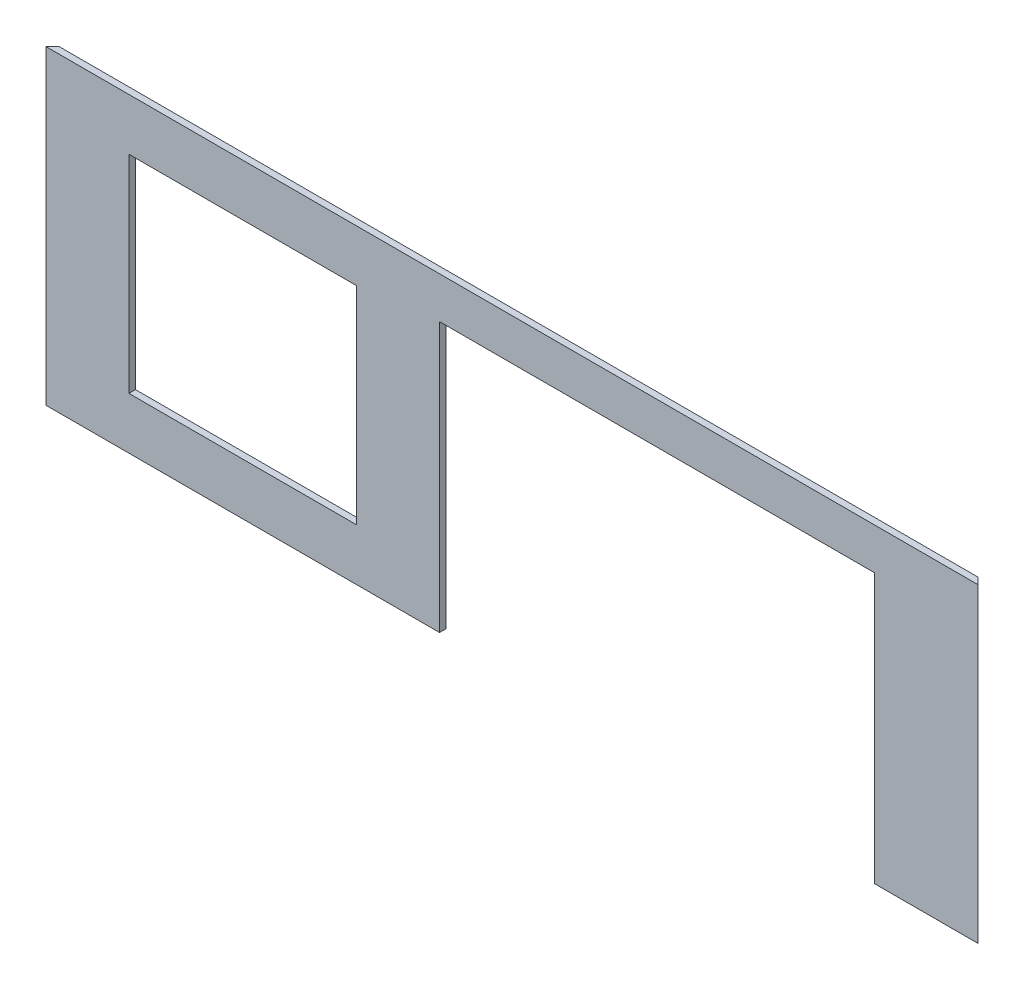
ISO-10303-21;
HEADER;
FILE_DESCRIPTION(('STEP AP214'),'2;1');
FILE_NAME('part.step','',(''),(''),'','','');
FILE_SCHEMA(('AUTOMOTIVE_DESIGN { 1 0 10303 214 1 1 1 1 }'));
ENDSEC;
DATA;
#1=APPLICATION_CONTEXT('core data for automotive mechanical design processes');
#2=APPLICATION_PROTOCOL_DEFINITION('international standard','automotive_design',2000,#1);
#3=PRODUCT_CONTEXT('',#1,'mechanical');
#4=PRODUCT('Part','Part','',(#3));
#5=PRODUCT_RELATED_PRODUCT_CATEGORY('part','',(#4));
#6=PRODUCT_DEFINITION_FORMATION('','',#4);
#7=PRODUCT_DEFINITION_CONTEXT('part definition',#1,'design');
#8=PRODUCT_DEFINITION('design','',#6,#7);
#9=PRODUCT_DEFINITION_SHAPE('','',#8);
#10=(LENGTH_UNIT() NAMED_UNIT(*) SI_UNIT(.MILLI.,.METRE.));
#11=(NAMED_UNIT(*) PLANE_ANGLE_UNIT() SI_UNIT($,.RADIAN.));
#12=(NAMED_UNIT(*) SI_UNIT($,.STERADIAN.) SOLID_ANGLE_UNIT());
#13=UNCERTAINTY_MEASURE_WITH_UNIT(LENGTH_MEASURE(1.E-05),#10,'distance_accuracy_value','');
#14=(GEOMETRIC_REPRESENTATION_CONTEXT(3) GLOBAL_UNCERTAINTY_ASSIGNED_CONTEXT((#13)) GLOBAL_UNIT_ASSIGNED_CONTEXT((#10,
#11,#12)) REPRESENTATION_CONTEXT('',''));
#15=CARTESIAN_POINT('',(0.,0.,0.));
#16=DIRECTION('',(0.,0.,1.));
#17=DIRECTION('',(1.,0.,0.));
#18=AXIS2_PLACEMENT_3D('',#15,#16,#17);
#19=CARTESIAN_POINT('',(0.,0.,3.175));
#20=DIRECTION('',(0.,1.,0.));
#21=DIRECTION('',(0.,0.,1.));
#22=AXIS2_PLACEMENT_3D('',#19,#20,#21);
#23=PLANE('',#22);
#24=DIRECTION('',(1.,0.,0.));
#25=VECTOR('',#24,1.);
#26=CARTESIAN_POINT('',(0.,0.,3.175));
#27=LINE('',#26,#25);
#28=CARTESIAN_POINT('',(400.,0.,3.175));
#29=VERTEX_POINT('',#28);
#30=CARTESIAN_POINT('',(450.,0.,3.175));
#31=VERTEX_POINT('',#30);
#32=EDGE_CURVE('E247',#29,#31,#27,.T.);
#33=ORIENTED_EDGE('',*,*,#32,.F.);
#34=DIRECTION('',(0.,0.,1.));
#35=VECTOR('',#34,1.);
#36=CARTESIAN_POINT('',(400.,0.,0.));
#37=LINE('',#36,#35);
#38=CARTESIAN_POINT('',(400.,0.,0.));
#39=VERTEX_POINT('',#38);
#40=EDGE_CURVE('E171',#39,#29,#37,.T.);
#41=ORIENTED_EDGE('',*,*,#40,.F.);
#42=DIRECTION('',(1.,0.,0.));
#43=VECTOR('',#42,1.);
#44=CARTESIAN_POINT('',(0.,0.,0.));
#45=LINE('',#44,#43);
#46=CARTESIAN_POINT('',(446.825,0.,0.));
#47=VERTEX_POINT('',#46);
#48=EDGE_CURVE('E157',#39,#47,#45,.T.);
#49=ORIENTED_EDGE('',*,*,#48,.T.);
#50=DIRECTION('',(0.707106781186546,0.,0.707106781186549));
#51=VECTOR('',#50,1.);
#52=CARTESIAN_POINT('',(450.,0.,3.175));
#53=LINE('',#52,#51);
#54=EDGE_CURVE('E237',#47,#31,#53,.T.);
#55=ORIENTED_EDGE('',*,*,#54,.T.);
#56=EDGE_LOOP('',(#33,#41,#49,#55));
#57=FACE_BOUND('',#56,.T.);
#58=ADVANCED_FACE('F42',(#57),#23,.F.);
#59=CARTESIAN_POINT('',(3.175,0.,0.));
#60=VERTEX_POINT('',#59);
#61=CARTESIAN_POINT('',(190.,0.,0.));
#62=VERTEX_POINT('',#61);
#63=EDGE_CURVE('E254',#60,#62,#45,.T.);
#64=ORIENTED_EDGE('',*,*,#63,.T.);
#65=DIRECTION('',(0.,0.,1.));
#66=VECTOR('',#65,1.);
#67=CARTESIAN_POINT('',(190.,0.,0.));
#68=LINE('',#67,#66);
#69=CARTESIAN_POINT('',(190.,0.,3.175));
#70=VERTEX_POINT('',#69);
#71=EDGE_CURVE('E175',#62,#70,#68,.T.);
#72=ORIENTED_EDGE('',*,*,#71,.T.);
#73=CARTESIAN_POINT('',(0.,0.,3.175));
#74=VERTEX_POINT('',#73);
#75=EDGE_CURVE('E248',#74,#70,#27,.T.);
#76=ORIENTED_EDGE('',*,*,#75,.F.);
#77=DIRECTION('',(0.707106781186547,0.,-0.707106781186547));
#78=VECTOR('',#77,1.);
#79=CARTESIAN_POINT('',(0.,0.,3.175));
#80=LINE('',#79,#78);
#81=EDGE_CURVE('E223',#74,#60,#80,.T.);
#82=ORIENTED_EDGE('',*,*,#81,.T.);
#83=EDGE_LOOP('',(#64,#72,#76,#82));
#84=FACE_BOUND('',#83,.T.);
#85=ADVANCED_FACE('F44',(#84),#23,.F.);
#86=CARTESIAN_POINT('',(0.,150.,3.175));
#87=DIRECTION('',(0.,-1.,0.));
#88=DIRECTION('',(0.,0.,-1.));
#89=AXIS2_PLACEMENT_3D('',#86,#87,#88);
#90=PLANE('',#89);
#91=DIRECTION('',(-1.,0.,0.));
#92=VECTOR('',#91,1.);
#93=CARTESIAN_POINT('',(0.,150.,0.));
#94=LINE('',#93,#92);
#95=CARTESIAN_POINT('',(446.825,150.,0.));
#96=VERTEX_POINT('',#95);
#97=CARTESIAN_POINT('',(3.175,150.,0.));
#98=VERTEX_POINT('',#97);
#99=EDGE_CURVE('E46',#96,#98,#94,.T.);
#100=ORIENTED_EDGE('',*,*,#99,.T.);
#101=DIRECTION('',(0.707106781186547,0.,-0.707106781186547));
#102=VECTOR('',#101,1.);
#103=CARTESIAN_POINT('',(0.,150.,3.175));
#104=LINE('',#103,#102);
#105=CARTESIAN_POINT('',(0.,150.,3.175));
#106=VERTEX_POINT('',#105);
#107=EDGE_CURVE('E228',#106,#98,#104,.T.);
#108=ORIENTED_EDGE('',*,*,#107,.F.);
#109=DIRECTION('',(-1.,0.,0.));
#110=VECTOR('',#109,1.);
#111=CARTESIAN_POINT('',(0.,150.,3.175));
#112=LINE('',#111,#110);
#113=CARTESIAN_POINT('',(450.,150.,3.175));
#114=VERTEX_POINT('',#113);
#115=EDGE_CURVE('E11',#114,#106,#112,.T.);
#116=ORIENTED_EDGE('',*,*,#115,.F.);
#117=DIRECTION('',(0.707106781186546,0.,0.707106781186549));
#118=VECTOR('',#117,1.);
#119=CARTESIAN_POINT('',(450.,150.,3.175));
#120=LINE('',#119,#118);
#121=EDGE_CURVE('E231',#96,#114,#120,.T.);
#122=ORIENTED_EDGE('',*,*,#121,.F.);
#123=EDGE_LOOP('',(#100,#108,#116,#122));
#124=FACE_BOUND('',#123,.T.);
#125=ADVANCED_FACE('F272',(#124),#90,.F.);
#126=CARTESIAN_POINT('',(0.,0.,3.175));
#127=DIRECTION('',(0.,0.,-1.));
#128=DIRECTION('',(-1.,0.,0.));
#129=AXIS2_PLACEMENT_3D('',#126,#127,#128);
#130=PLANE('',#129);
#131=DIRECTION('',(1.,0.,0.));
#132=VECTOR('',#131,1.);
#133=CARTESIAN_POINT('',(40.,25.,3.175));
#134=LINE('',#133,#132);
#135=CARTESIAN_POINT('',(40.,25.,3.175));
#136=VERTEX_POINT('',#135);
#137=CARTESIAN_POINT('',(150.,25.,3.175));
#138=VERTEX_POINT('',#137);
#139=EDGE_CURVE('E203',#136,#138,#134,.T.);
#140=ORIENTED_EDGE('',*,*,#139,.F.);
#141=DIRECTION('',(0.,-1.,0.));
#142=VECTOR('',#141,1.);
#143=CARTESIAN_POINT('',(40.,25.,3.175));
#144=LINE('',#143,#142);
#145=CARTESIAN_POINT('',(40.,125.,3.175));
#146=VERTEX_POINT('',#145);
#147=EDGE_CURVE('E60',#146,#136,#144,.T.);
#148=ORIENTED_EDGE('',*,*,#147,.F.);
#149=DIRECTION('',(-1.,0.,0.));
#150=VECTOR('',#149,1.);
#151=CARTESIAN_POINT('',(40.,125.,3.175));
#152=LINE('',#151,#150);
#153=CARTESIAN_POINT('',(150.,125.,3.175));
#154=VERTEX_POINT('',#153);
#155=EDGE_CURVE('E194',#154,#146,#152,.T.);
#156=ORIENTED_EDGE('',*,*,#155,.F.);
#157=DIRECTION('',(0.,1.,0.));
#158=VECTOR('',#157,1.);
#159=CARTESIAN_POINT('',(150.,25.,3.175));
#160=LINE('',#159,#158);
#161=EDGE_CURVE('E198',#138,#154,#160,.T.);
#162=ORIENTED_EDGE('',*,*,#161,.F.);
#163=EDGE_LOOP('',(#140,#148,#156,#162));
#164=FACE_BOUND('',#163,.T.);
#165=DIRECTION('',(-1.,0.,0.));
#166=VECTOR('',#165,1.);
#167=CARTESIAN_POINT('',(400.,130.,3.175));
#168=LINE('',#167,#166);
#169=CARTESIAN_POINT('',(400.,130.,3.175));
#170=VERTEX_POINT('',#169);
#171=CARTESIAN_POINT('',(190.,130.,3.175));
#172=VERTEX_POINT('',#171);
#173=EDGE_CURVE('E162',#170,#172,#168,.T.);
#174=ORIENTED_EDGE('',*,*,#173,.F.);
#175=DIRECTION('',(0.,1.,0.));
#176=VECTOR('',#175,1.);
#177=CARTESIAN_POINT('',(400.,0.,3.175));
#178=LINE('',#177,#176);
#179=EDGE_CURVE('E140',#29,#170,#178,.T.);
#180=ORIENTED_EDGE('',*,*,#179,.F.);
#181=ORIENTED_EDGE('',*,*,#32,.T.);
#182=DIRECTION('',(0.,1.,0.));
#183=VECTOR('',#182,1.);
#184=CARTESIAN_POINT('',(450.,0.,3.175));
#185=LINE('',#184,#183);
#186=EDGE_CURVE('E52',#31,#114,#185,.T.);
#187=ORIENTED_EDGE('',*,*,#186,.T.);
#188=ORIENTED_EDGE('',*,*,#115,.T.);
#189=DIRECTION('',(0.,-1.,0.));
#190=VECTOR('',#189,1.);
#191=CARTESIAN_POINT('',(0.,0.,3.175));
#192=LINE('',#191,#190);
#193=EDGE_CURVE('E243',#106,#74,#192,.T.);
#194=ORIENTED_EDGE('',*,*,#193,.T.);
#195=ORIENTED_EDGE('',*,*,#75,.T.);
#196=DIRECTION('',(0.,-1.,0.));
#197=VECTOR('',#196,1.);
#198=CARTESIAN_POINT('',(190.,0.,3.175));
#199=LINE('',#198,#197);
#200=EDGE_CURVE('E159',#172,#70,#199,.T.);
#201=ORIENTED_EDGE('',*,*,#200,.F.);
#202=EDGE_LOOP('',(#174,#180,#181,#187,#188,#194,#195,#201));
#203=FACE_BOUND('',#202,.T.);
#204=ADVANCED_FACE('F275',(#164,#203),#130,.F.);
#205=CARTESIAN_POINT('',(0.,0.,0.));
#206=DIRECTION('',(0.,0.,-1.));
#207=DIRECTION('',(-1.,0.,0.));
#208=AXIS2_PLACEMENT_3D('',#205,#206,#207);
#209=PLANE('',#208);
#210=DIRECTION('',(0.,1.,0.));
#211=VECTOR('',#210,1.);
#212=CARTESIAN_POINT('',(400.,0.,0.));
#213=LINE('',#212,#211);
#214=CARTESIAN_POINT('',(400.,130.,0.));
#215=VERTEX_POINT('',#214);
#216=EDGE_CURVE('E137',#39,#215,#213,.T.);
#217=ORIENTED_EDGE('',*,*,#216,.T.);
#218=DIRECTION('',(-1.,0.,0.));
#219=VECTOR('',#218,1.);
#220=CARTESIAN_POINT('',(400.,130.,0.));
#221=LINE('',#220,#219);
#222=CARTESIAN_POINT('',(190.,130.,0.));
#223=VERTEX_POINT('',#222);
#224=EDGE_CURVE('E148',#215,#223,#221,.T.);
#225=ORIENTED_EDGE('',*,*,#224,.T.);
#226=DIRECTION('',(0.,-1.,0.));
#227=VECTOR('',#226,1.);
#228=CARTESIAN_POINT('',(190.,0.,0.));
#229=LINE('',#228,#227);
#230=EDGE_CURVE('E68',#223,#62,#229,.T.);
#231=ORIENTED_EDGE('',*,*,#230,.T.);
#232=ORIENTED_EDGE('',*,*,#63,.F.);
#233=DIRECTION('',(0.,1.,0.));
#234=VECTOR('',#233,1.);
#235=CARTESIAN_POINT('',(3.175,0.,0.));
#236=LINE('',#235,#234);
#237=EDGE_CURVE('E227',#60,#98,#236,.T.);
#238=ORIENTED_EDGE('',*,*,#237,.T.);
#239=ORIENTED_EDGE('',*,*,#99,.F.);
#240=DIRECTION('',(0.,1.,0.));
#241=VECTOR('',#240,1.);
#242=CARTESIAN_POINT('',(446.825,0.,0.));
#243=LINE('',#242,#241);
#244=EDGE_CURVE('E174',#47,#96,#243,.T.);
#245=ORIENTED_EDGE('',*,*,#244,.F.);
#246=ORIENTED_EDGE('',*,*,#48,.F.);
#247=EDGE_LOOP('',(#217,#225,#231,#232,#238,#239,#245,#246));
#248=FACE_BOUND('',#247,.T.);
#249=DIRECTION('',(0.,-1.,0.));
#250=VECTOR('',#249,1.);
#251=CARTESIAN_POINT('',(40.,25.,0.));
#252=LINE('',#251,#250);
#253=CARTESIAN_POINT('',(40.,125.,0.));
#254=VERTEX_POINT('',#253);
#255=CARTESIAN_POINT('',(40.,25.,0.));
#256=VERTEX_POINT('',#255);
#257=EDGE_CURVE('E199',#254,#256,#252,.T.);
#258=ORIENTED_EDGE('',*,*,#257,.T.);
#259=DIRECTION('',(1.,0.,0.));
#260=VECTOR('',#259,1.);
#261=CARTESIAN_POINT('',(40.,25.,0.));
#262=LINE('',#261,#260);
#263=CARTESIAN_POINT('',(150.,25.,0.));
#264=VERTEX_POINT('',#263);
#265=EDGE_CURVE('E216',#256,#264,#262,.T.);
#266=ORIENTED_EDGE('',*,*,#265,.T.);
#267=DIRECTION('',(0.,1.,0.));
#268=VECTOR('',#267,1.);
#269=CARTESIAN_POINT('',(150.,25.,0.));
#270=LINE('',#269,#268);
#271=CARTESIAN_POINT('',(150.,125.,0.));
#272=VERTEX_POINT('',#271);
#273=EDGE_CURVE('E212',#264,#272,#270,.T.);
#274=ORIENTED_EDGE('',*,*,#273,.T.);
#275=DIRECTION('',(-1.,0.,0.));
#276=VECTOR('',#275,1.);
#277=CARTESIAN_POINT('',(40.,125.,0.));
#278=LINE('',#277,#276);
#279=EDGE_CURVE('E184',#272,#254,#278,.T.);
#280=ORIENTED_EDGE('',*,*,#279,.T.);
#281=EDGE_LOOP('',(#258,#266,#274,#280));
#282=FACE_BOUND('',#281,.T.);
#283=ADVANCED_FACE('F154',(#248,#282),#209,.T.);
#284=CARTESIAN_POINT('',(450.,0.,3.175));
#285=DIRECTION('',(-0.707106781186549,0.,0.707106781186546));
#286=DIRECTION('',(0.707106781186546,0.,0.707106781186549));
#287=AXIS2_PLACEMENT_3D('',#284,#285,#286);
#288=PLANE('',#287);
#289=ORIENTED_EDGE('',*,*,#121,.T.);
#290=ORIENTED_EDGE('',*,*,#186,.F.);
#291=ORIENTED_EDGE('',*,*,#54,.F.);
#292=ORIENTED_EDGE('',*,*,#244,.T.);
#293=EDGE_LOOP('',(#289,#290,#291,#292));
#294=FACE_BOUND('',#293,.T.);
#295=ADVANCED_FACE('F267',(#294),#288,.F.);
#296=CARTESIAN_POINT('',(0.,0.,3.175));
#297=DIRECTION('',(0.707106781186548,0.,0.707106781186548));
#298=DIRECTION('',(0.707106781186548,0.,-0.707106781186548));
#299=AXIS2_PLACEMENT_3D('',#296,#297,#298);
#300=PLANE('',#299);
#301=ORIENTED_EDGE('',*,*,#107,.T.);
#302=ORIENTED_EDGE('',*,*,#237,.F.);
#303=ORIENTED_EDGE('',*,*,#81,.F.);
#304=ORIENTED_EDGE('',*,*,#193,.F.);
#305=EDGE_LOOP('',(#301,#302,#303,#304));
#306=FACE_BOUND('',#305,.T.);
#307=ADVANCED_FACE('F281',(#306),#300,.F.);
#308=CARTESIAN_POINT('',(40.,25.,0.));
#309=DIRECTION('',(-1.,0.,0.));
#310=DIRECTION('',(0.,0.,1.));
#311=AXIS2_PLACEMENT_3D('',#308,#309,#310);
#312=PLANE('',#311);
#313=ORIENTED_EDGE('',*,*,#147,.T.);
#314=DIRECTION('',(0.,0.,1.));
#315=VECTOR('',#314,1.);
#316=CARTESIAN_POINT('',(40.,25.,0.));
#317=LINE('',#316,#315);
#318=EDGE_CURVE('E181',#256,#136,#317,.T.);
#319=ORIENTED_EDGE('',*,*,#318,.F.);
#320=ORIENTED_EDGE('',*,*,#257,.F.);
#321=DIRECTION('',(0.,0.,1.));
#322=VECTOR('',#321,1.);
#323=CARTESIAN_POINT('',(40.,125.,0.));
#324=LINE('',#323,#322);
#325=EDGE_CURVE('E191',#254,#146,#324,.T.);
#326=ORIENTED_EDGE('',*,*,#325,.T.);
#327=EDGE_LOOP('',(#313,#319,#320,#326));
#328=FACE_BOUND('',#327,.T.);
#329=ADVANCED_FACE('F283',(#328),#312,.F.);
#330=CARTESIAN_POINT('',(40.,125.,0.));
#331=DIRECTION('',(0.,1.,0.));
#332=DIRECTION('',(0.,0.,1.));
#333=AXIS2_PLACEMENT_3D('',#330,#331,#332);
#334=PLANE('',#333);
#335=ORIENTED_EDGE('',*,*,#155,.T.);
#336=ORIENTED_EDGE('',*,*,#325,.F.);
#337=ORIENTED_EDGE('',*,*,#279,.F.);
#338=DIRECTION('',(0.,0.,1.));
#339=VECTOR('',#338,1.);
#340=CARTESIAN_POINT('',(150.,125.,0.));
#341=LINE('',#340,#339);
#342=EDGE_CURVE('E188',#272,#154,#341,.T.);
#343=ORIENTED_EDGE('',*,*,#342,.T.);
#344=EDGE_LOOP('',(#335,#336,#337,#343));
#345=FACE_BOUND('',#344,.T.);
#346=ADVANCED_FACE('F290',(#345),#334,.F.);
#347=CARTESIAN_POINT('',(150.,25.,0.));
#348=DIRECTION('',(1.,0.,0.));
#349=DIRECTION('',(0.,0.,-1.));
#350=AXIS2_PLACEMENT_3D('',#347,#348,#349);
#351=PLANE('',#350);
#352=ORIENTED_EDGE('',*,*,#161,.T.);
#353=ORIENTED_EDGE('',*,*,#342,.F.);
#354=ORIENTED_EDGE('',*,*,#273,.F.);
#355=DIRECTION('',(0.,0.,1.));
#356=VECTOR('',#355,1.);
#357=CARTESIAN_POINT('',(150.,25.,0.));
#358=LINE('',#357,#356);
#359=EDGE_CURVE('E185',#264,#138,#358,.T.);
#360=ORIENTED_EDGE('',*,*,#359,.T.);
#361=EDGE_LOOP('',(#352,#353,#354,#360));
#362=FACE_BOUND('',#361,.T.);
#363=ADVANCED_FACE('F327',(#362),#351,.F.);
#364=CARTESIAN_POINT('',(40.,25.,0.));
#365=DIRECTION('',(0.,-1.,0.));
#366=DIRECTION('',(1.,0.,0.));
#367=AXIS2_PLACEMENT_3D('',#364,#365,#366);
#368=PLANE('',#367);
#369=ORIENTED_EDGE('',*,*,#139,.T.);
#370=ORIENTED_EDGE('',*,*,#359,.F.);
#371=ORIENTED_EDGE('',*,*,#265,.F.);
#372=ORIENTED_EDGE('',*,*,#318,.T.);
#373=EDGE_LOOP('',(#369,#370,#371,#372));
#374=FACE_BOUND('',#373,.T.);
#375=ADVANCED_FACE('F337',(#374),#368,.F.);
#376=CARTESIAN_POINT('',(400.,0.,0.));
#377=DIRECTION('',(1.,0.,0.));
#378=DIRECTION('',(0.,0.,-1.));
#379=AXIS2_PLACEMENT_3D('',#376,#377,#378);
#380=PLANE('',#379);
#381=ORIENTED_EDGE('',*,*,#179,.T.);
#382=DIRECTION('',(0.,0.,1.));
#383=VECTOR('',#382,1.);
#384=CARTESIAN_POINT('',(400.,130.,0.));
#385=LINE('',#384,#383);
#386=EDGE_CURVE('E133',#215,#170,#385,.T.);
#387=ORIENTED_EDGE('',*,*,#386,.F.);
#388=ORIENTED_EDGE('',*,*,#216,.F.);
#389=ORIENTED_EDGE('',*,*,#40,.T.);
#390=EDGE_LOOP('',(#381,#387,#388,#389));
#391=FACE_BOUND('',#390,.T.);
#392=ADVANCED_FACE('F135',(#391),#380,.F.);
#393=CARTESIAN_POINT('',(190.,0.,0.));
#394=DIRECTION('',(-1.,0.,0.));
#395=DIRECTION('',(0.,0.,1.));
#396=AXIS2_PLACEMENT_3D('',#393,#394,#395);
#397=PLANE('',#396);
#398=ORIENTED_EDGE('',*,*,#200,.T.);
#399=ORIENTED_EDGE('',*,*,#71,.F.);
#400=ORIENTED_EDGE('',*,*,#230,.F.);
#401=DIRECTION('',(0.,0.,1.));
#402=VECTOR('',#401,1.);
#403=CARTESIAN_POINT('',(190.,130.,0.));
#404=LINE('',#403,#402);
#405=EDGE_CURVE('E145',#223,#172,#404,.T.);
#406=ORIENTED_EDGE('',*,*,#405,.T.);
#407=EDGE_LOOP('',(#398,#399,#400,#406));
#408=FACE_BOUND('',#407,.T.);
#409=ADVANCED_FACE('F279',(#408),#397,.F.);
#410=CARTESIAN_POINT('',(400.,130.,0.));
#411=DIRECTION('',(0.,1.,0.));
#412=DIRECTION('',(-1.,0.,0.));
#413=AXIS2_PLACEMENT_3D('',#410,#411,#412);
#414=PLANE('',#413);
#415=ORIENTED_EDGE('',*,*,#173,.T.);
#416=ORIENTED_EDGE('',*,*,#405,.F.);
#417=ORIENTED_EDGE('',*,*,#224,.F.);
#418=ORIENTED_EDGE('',*,*,#386,.T.);
#419=EDGE_LOOP('',(#415,#416,#417,#418));
#420=FACE_BOUND('',#419,.T.);
#421=ADVANCED_FACE('F149',(#420),#414,.F.);
#422=CLOSED_SHELL('',(#58,#85,#125,#204,#283,#295,#307,#329,#346,#363,#375,#392,#409,#421));
#423=MANIFOLD_SOLID_BREP('B2',#422);
#424=ADVANCED_BREP_SHAPE_REPRESENTATION('',(#18,#423),#14);
#425=SHAPE_DEFINITION_REPRESENTATION(#9,#424);
ENDSEC;
END-ISO-10303-21;
